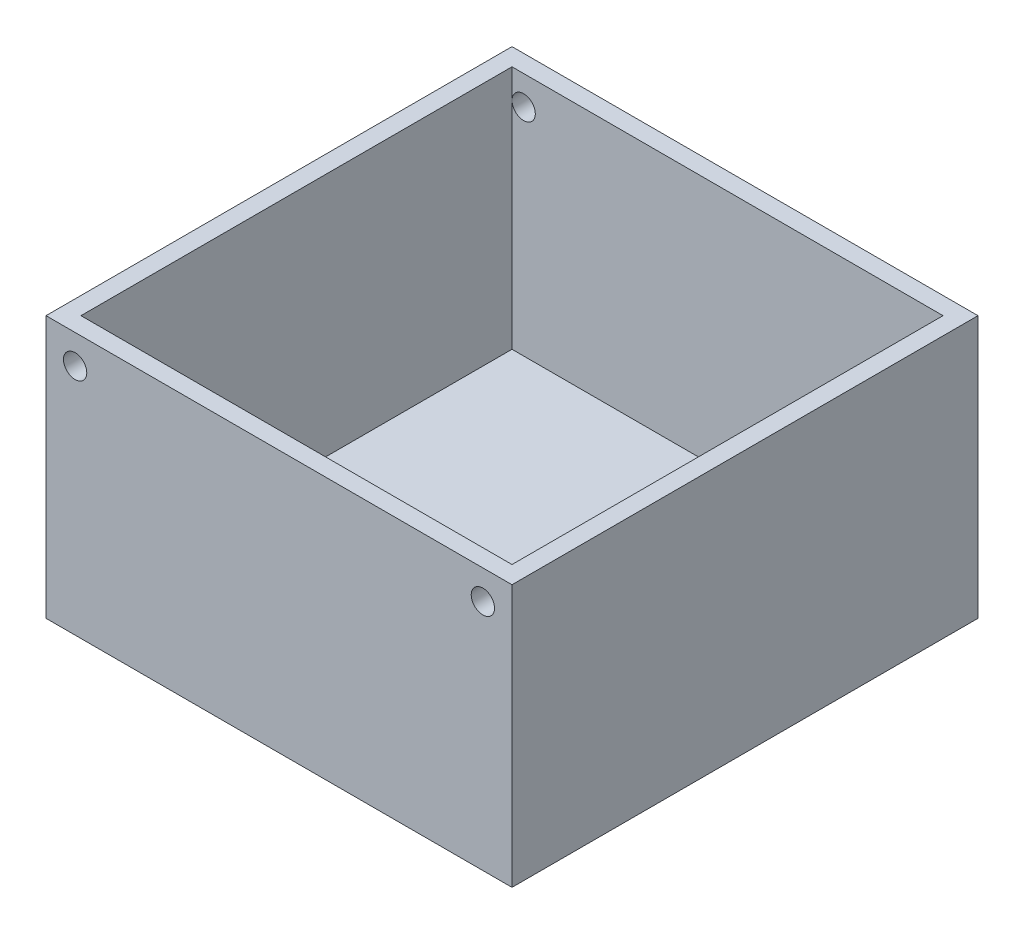
ISO-10303-21;
HEADER;
FILE_DESCRIPTION(('STEP AP214'),'2;1');
FILE_NAME('part.step','',(''),(''),'','','');
FILE_SCHEMA(('AUTOMOTIVE_DESIGN { 1 0 10303 214 1 1 1 1 }'));
ENDSEC;
DATA;
#1=APPLICATION_CONTEXT('core data for automotive mechanical design processes');
#2=APPLICATION_PROTOCOL_DEFINITION('international standard','automotive_design',2000,#1);
#3=PRODUCT_CONTEXT('',#1,'mechanical');
#4=PRODUCT('Part','Part','',(#3));
#5=PRODUCT_RELATED_PRODUCT_CATEGORY('part','',(#4));
#6=PRODUCT_DEFINITION_FORMATION('','',#4);
#7=PRODUCT_DEFINITION_CONTEXT('part definition',#1,'design');
#8=PRODUCT_DEFINITION('design','',#6,#7);
#9=PRODUCT_DEFINITION_SHAPE('','',#8);
#10=(LENGTH_UNIT() NAMED_UNIT(*) SI_UNIT(.MILLI.,.METRE.));
#11=(NAMED_UNIT(*) PLANE_ANGLE_UNIT() SI_UNIT($,.RADIAN.));
#12=(NAMED_UNIT(*) SI_UNIT($,.STERADIAN.) SOLID_ANGLE_UNIT());
#13=UNCERTAINTY_MEASURE_WITH_UNIT(LENGTH_MEASURE(1.E-05),#10,'distance_accuracy_value','');
#14=(GEOMETRIC_REPRESENTATION_CONTEXT(3) GLOBAL_UNCERTAINTY_ASSIGNED_CONTEXT((#13)) GLOBAL_UNIT_ASSIGNED_CONTEXT((#10,
#11,#12)) REPRESENTATION_CONTEXT('',''));
#15=CARTESIAN_POINT('',(0.,0.,0.));
#16=DIRECTION('',(0.,0.,1.));
#17=DIRECTION('',(1.,0.,0.));
#18=AXIS2_PLACEMENT_3D('',#15,#16,#17);
#19=CARTESIAN_POINT('',(0.,45.,80.));
#20=DIRECTION('',(0.,1.,0.));
#21=DIRECTION('',(-1.,0.,0.));
#22=AXIS2_PLACEMENT_3D('',#19,#20,#21);
#23=PLANE('',#22);
#24=DIRECTION('',(1.,0.,0.));
#25=VECTOR('',#24,1.);
#26=CARTESIAN_POINT('',(0.,45.,0.));
#27=LINE('',#26,#25);
#28=CARTESIAN_POINT('',(-40.,45.,0.));
#29=VERTEX_POINT('',#28);
#30=CARTESIAN_POINT('',(40.,45.,0.));
#31=VERTEX_POINT('',#30);
#32=EDGE_CURVE('E184',#29,#31,#27,.T.);
#33=ORIENTED_EDGE('',*,*,#32,.F.);
#34=DIRECTION('',(0.,0.,-1.));
#35=VECTOR('',#34,1.);
#36=CARTESIAN_POINT('',(-40.,45.,80.));
#37=LINE('',#36,#35);
#38=CARTESIAN_POINT('',(-40.,45.,80.));
#39=VERTEX_POINT('',#38);
#40=EDGE_CURVE('E48',#39,#29,#37,.T.);
#41=ORIENTED_EDGE('',*,*,#40,.F.);
#42=DIRECTION('',(1.,0.,0.));
#43=VECTOR('',#42,1.);
#44=CARTESIAN_POINT('',(0.,45.,80.));
#45=LINE('',#44,#43);
#46=CARTESIAN_POINT('',(40.,45.,80.));
#47=VERTEX_POINT('',#46);
#48=EDGE_CURVE('E172',#39,#47,#45,.T.);
#49=ORIENTED_EDGE('',*,*,#48,.T.);
#50=DIRECTION('',(0.,0.,-1.));
#51=VECTOR('',#50,1.);
#52=CARTESIAN_POINT('',(40.,45.,80.));
#53=LINE('',#52,#51);
#54=EDGE_CURVE('E11',#47,#31,#53,.T.);
#55=ORIENTED_EDGE('',*,*,#54,.T.);
#56=EDGE_LOOP('',(#33,#41,#49,#55));
#57=FACE_BOUND('',#56,.T.);
#58=DIRECTION('',(0.,0.,-1.));
#59=VECTOR('',#58,1.);
#60=CARTESIAN_POINT('',(-37.,45.,80.));
#61=LINE('',#60,#59);
#62=CARTESIAN_POINT('',(-37.,45.,77.));
#63=VERTEX_POINT('',#62);
#64=CARTESIAN_POINT('',(-37.,45.,3.));
#65=VERTEX_POINT('',#64);
#66=EDGE_CURVE('E158',#63,#65,#61,.T.);
#67=ORIENTED_EDGE('',*,*,#66,.T.);
#68=DIRECTION('',(1.,0.,0.));
#69=VECTOR('',#68,1.);
#70=CARTESIAN_POINT('',(0.,45.,3.));
#71=LINE('',#70,#69);
#72=CARTESIAN_POINT('',(37.,45.,3.));
#73=VERTEX_POINT('',#72);
#74=EDGE_CURVE('E143',#65,#73,#71,.T.);
#75=ORIENTED_EDGE('',*,*,#74,.T.);
#76=DIRECTION('',(0.,0.,-1.));
#77=VECTOR('',#76,1.);
#78=CARTESIAN_POINT('',(37.,45.,80.));
#79=LINE('',#78,#77);
#80=CARTESIAN_POINT('',(37.,45.,77.));
#81=VERTEX_POINT('',#80);
#82=EDGE_CURVE('E163',#81,#73,#79,.T.);
#83=ORIENTED_EDGE('',*,*,#82,.F.);
#84=DIRECTION('',(1.,0.,0.));
#85=VECTOR('',#84,1.);
#86=CARTESIAN_POINT('',(0.,45.,77.));
#87=LINE('',#86,#85);
#88=EDGE_CURVE('E153',#63,#81,#87,.T.);
#89=ORIENTED_EDGE('',*,*,#88,.F.);
#90=EDGE_LOOP('',(#67,#75,#83,#89));
#91=FACE_BOUND('',#90,.T.);
#92=ADVANCED_FACE('F39',(#57,#91),#23,.T.);
#93=CARTESIAN_POINT('',(40.,0.,80.));
#94=DIRECTION('',(-1.,0.,0.));
#95=DIRECTION('',(0.,-1.,0.));
#96=AXIS2_PLACEMENT_3D('',#93,#94,#95);
#97=PLANE('',#96);
#98=DIRECTION('',(0.,1.,0.));
#99=VECTOR('',#98,1.);
#100=CARTESIAN_POINT('',(40.,0.,0.));
#101=LINE('',#100,#99);
#102=CARTESIAN_POINT('',(40.,0.,0.));
#103=VERTEX_POINT('',#102);
#104=EDGE_CURVE('E164',#103,#31,#101,.T.);
#105=ORIENTED_EDGE('',*,*,#104,.T.);
#106=ORIENTED_EDGE('',*,*,#54,.F.);
#107=DIRECTION('',(0.,1.,0.));
#108=VECTOR('',#107,1.);
#109=CARTESIAN_POINT('',(40.,0.,80.));
#110=LINE('',#109,#108);
#111=CARTESIAN_POINT('',(40.,0.,80.));
#112=VERTEX_POINT('',#111);
#113=EDGE_CURVE('E170',#112,#47,#110,.T.);
#114=ORIENTED_EDGE('',*,*,#113,.F.);
#115=DIRECTION('',(0.,0.,-1.));
#116=VECTOR('',#115,1.);
#117=CARTESIAN_POINT('',(40.,0.,80.));
#118=LINE('',#117,#116);
#119=EDGE_CURVE('E181',#112,#103,#118,.T.);
#120=ORIENTED_EDGE('',*,*,#119,.T.);
#121=EDGE_LOOP('',(#105,#106,#114,#120));
#122=FACE_BOUND('',#121,.T.);
#123=ADVANCED_FACE('F41',(#122),#97,.F.);
#124=CARTESIAN_POINT('',(-40.,0.,80.));
#125=DIRECTION('',(-1.,0.,0.));
#126=DIRECTION('',(0.,0.,1.));
#127=AXIS2_PLACEMENT_3D('',#124,#125,#126);
#128=PLANE('',#127);
#129=DIRECTION('',(0.,1.,0.));
#130=VECTOR('',#129,1.);
#131=CARTESIAN_POINT('',(-40.,0.,0.));
#132=LINE('',#131,#130);
#133=CARTESIAN_POINT('',(-40.,0.,0.));
#134=VERTEX_POINT('',#133);
#135=EDGE_CURVE('E187',#134,#29,#132,.T.);
#136=ORIENTED_EDGE('',*,*,#135,.F.);
#137=DIRECTION('',(0.,0.,-1.));
#138=VECTOR('',#137,1.);
#139=CARTESIAN_POINT('',(-40.,0.,80.));
#140=LINE('',#139,#138);
#141=CARTESIAN_POINT('',(-40.,0.,80.));
#142=VERTEX_POINT('',#141);
#143=EDGE_CURVE('E193',#142,#134,#140,.T.);
#144=ORIENTED_EDGE('',*,*,#143,.F.);
#145=DIRECTION('',(0.,1.,0.));
#146=VECTOR('',#145,1.);
#147=CARTESIAN_POINT('',(-40.,0.,80.));
#148=LINE('',#147,#146);
#149=EDGE_CURVE('E176',#142,#39,#148,.T.);
#150=ORIENTED_EDGE('',*,*,#149,.T.);
#151=ORIENTED_EDGE('',*,*,#40,.T.);
#152=EDGE_LOOP('',(#136,#144,#150,#151));
#153=FACE_BOUND('',#152,.T.);
#154=ADVANCED_FACE('F240',(#153),#128,.T.);
#155=CARTESIAN_POINT('',(0.,0.,80.));
#156=DIRECTION('',(0.,1.,0.));
#157=DIRECTION('',(-1.,0.,0.));
#158=AXIS2_PLACEMENT_3D('',#155,#156,#157);
#159=PLANE('',#158);
#160=DIRECTION('',(1.,0.,0.));
#161=VECTOR('',#160,1.);
#162=CARTESIAN_POINT('',(0.,0.,0.));
#163=LINE('',#162,#161);
#164=EDGE_CURVE('E173',#134,#103,#163,.T.);
#165=ORIENTED_EDGE('',*,*,#164,.T.);
#166=ORIENTED_EDGE('',*,*,#119,.F.);
#167=DIRECTION('',(1.,0.,0.));
#168=VECTOR('',#167,1.);
#169=CARTESIAN_POINT('',(0.,0.,80.));
#170=LINE('',#169,#168);
#171=EDGE_CURVE('E179',#142,#112,#170,.T.);
#172=ORIENTED_EDGE('',*,*,#171,.F.);
#173=ORIENTED_EDGE('',*,*,#143,.T.);
#174=EDGE_LOOP('',(#165,#166,#172,#173));
#175=FACE_BOUND('',#174,.T.);
#176=ADVANCED_FACE('F237',(#175),#159,.F.);
#177=CARTESIAN_POINT('',(0.,0.,80.));
#178=DIRECTION('',(0.,0.,1.));
#179=DIRECTION('',(1.,0.,0.));
#180=AXIS2_PLACEMENT_3D('',#177,#178,#179);
#181=PLANE('',#180);
#182=CARTESIAN_POINT('',(-35.,40.,80.));
#183=DIRECTION('',(0.,0.,1.));
#184=DIRECTION('',(1.,0.,0.));
#185=AXIS2_PLACEMENT_3D('',#182,#183,#184);
#186=CIRCLE('',#185,2.);
#187=CARTESIAN_POINT('',(-33.,40.,80.));
#188=VERTEX_POINT('',#187);
#189=EDGE_CURVE('E196',#188,#188,#186,.T.);
#190=ORIENTED_EDGE('',*,*,#189,.F.);
#191=EDGE_LOOP('',(#190));
#192=FACE_BOUND('',#191,.T.);
#193=CARTESIAN_POINT('',(35.,40.,80.));
#194=DIRECTION('',(0.,0.,1.));
#195=DIRECTION('',(1.,0.,0.));
#196=AXIS2_PLACEMENT_3D('',#193,#194,#195);
#197=CIRCLE('',#196,2.);
#198=CARTESIAN_POINT('',(37.,40.,80.));
#199=VERTEX_POINT('',#198);
#200=EDGE_CURVE('E200',#199,#199,#197,.T.);
#201=ORIENTED_EDGE('',*,*,#200,.F.);
#202=EDGE_LOOP('',(#201));
#203=FACE_BOUND('',#202,.T.);
#204=ORIENTED_EDGE('',*,*,#113,.T.);
#205=ORIENTED_EDGE('',*,*,#48,.F.);
#206=ORIENTED_EDGE('',*,*,#149,.F.);
#207=ORIENTED_EDGE('',*,*,#171,.T.);
#208=EDGE_LOOP('',(#204,#205,#206,#207));
#209=FACE_BOUND('',#208,.T.);
#210=ADVANCED_FACE('F223',(#192,#203,#209),#181,.T.);
#211=CARTESIAN_POINT('',(0.,0.,0.));
#212=DIRECTION('',(0.,0.,1.));
#213=DIRECTION('',(1.,0.,0.));
#214=AXIS2_PLACEMENT_3D('',#211,#212,#213);
#215=PLANE('',#214);
#216=CARTESIAN_POINT('',(-35.,40.,0.));
#217=DIRECTION('',(0.,0.,1.));
#218=DIRECTION('',(1.,0.,0.));
#219=AXIS2_PLACEMENT_3D('',#216,#217,#218);
#220=CIRCLE('',#219,2.);
#221=CARTESIAN_POINT('',(-33.,40.,0.));
#222=VERTEX_POINT('',#221);
#223=EDGE_CURVE('E148',#222,#222,#220,.F.);
#224=ORIENTED_EDGE('',*,*,#223,.F.);
#225=EDGE_LOOP('',(#224));
#226=FACE_BOUND('',#225,.T.);
#227=CARTESIAN_POINT('',(35.,40.,0.));
#228=DIRECTION('',(0.,0.,1.));
#229=DIRECTION('',(1.,0.,0.));
#230=AXIS2_PLACEMENT_3D('',#227,#228,#229);
#231=CIRCLE('',#230,2.);
#232=CARTESIAN_POINT('',(37.,40.,0.));
#233=VERTEX_POINT('',#232);
#234=EDGE_CURVE('E197',#233,#233,#231,.F.);
#235=ORIENTED_EDGE('',*,*,#234,.F.);
#236=EDGE_LOOP('',(#235));
#237=FACE_BOUND('',#236,.T.);
#238=ORIENTED_EDGE('',*,*,#104,.F.);
#239=ORIENTED_EDGE('',*,*,#164,.F.);
#240=ORIENTED_EDGE('',*,*,#135,.T.);
#241=ORIENTED_EDGE('',*,*,#32,.T.);
#242=EDGE_LOOP('',(#238,#239,#240,#241));
#243=FACE_BOUND('',#242,.T.);
#244=ADVANCED_FACE('F220',(#226,#237,#243),#215,.F.);
#245=CARTESIAN_POINT('',(37.,0.,80.));
#246=DIRECTION('',(-1.,0.,0.));
#247=DIRECTION('',(0.,-1.,0.));
#248=AXIS2_PLACEMENT_3D('',#245,#246,#247);
#249=PLANE('',#248);
#250=DIRECTION('',(0.,1.,0.));
#251=VECTOR('',#250,1.);
#252=CARTESIAN_POINT('',(37.,0.,77.));
#253=LINE('',#252,#251);
#254=CARTESIAN_POINT('',(37.,3.00000000000001,77.));
#255=VERTEX_POINT('',#254);
#256=CARTESIAN_POINT('',(37.,40.,77.));
#257=VERTEX_POINT('',#256);
#258=EDGE_CURVE('E152',#255,#257,#253,.T.);
#259=ORIENTED_EDGE('',*,*,#258,.T.);
#260=EDGE_CURVE('E127',#257,#81,#253,.T.);
#261=ORIENTED_EDGE('',*,*,#260,.T.);
#262=ORIENTED_EDGE('',*,*,#82,.T.);
#263=DIRECTION('',(0.,1.,0.));
#264=VECTOR('',#263,1.);
#265=CARTESIAN_POINT('',(37.,0.,3.));
#266=LINE('',#265,#264);
#267=CARTESIAN_POINT('',(37.,40.,3.));
#268=VERTEX_POINT('',#267);
#269=EDGE_CURVE('E142',#268,#73,#266,.T.);
#270=ORIENTED_EDGE('',*,*,#269,.F.);
#271=CARTESIAN_POINT('',(37.,3.00000000000001,3.));
#272=VERTEX_POINT('',#271);
#273=EDGE_CURVE('E122',#272,#268,#266,.T.);
#274=ORIENTED_EDGE('',*,*,#273,.F.);
#275=DIRECTION('',(0.,0.,-1.));
#276=VECTOR('',#275,1.);
#277=CARTESIAN_POINT('',(37.,3.00000000000001,80.));
#278=LINE('',#277,#276);
#279=EDGE_CURVE('E130',#255,#272,#278,.T.);
#280=ORIENTED_EDGE('',*,*,#279,.F.);
#281=EDGE_LOOP('',(#259,#261,#262,#270,#274,#280));
#282=FACE_BOUND('',#281,.T.);
#283=ADVANCED_FACE('F140',(#282),#249,.T.);
#284=CARTESIAN_POINT('',(-37.,0.,80.));
#285=DIRECTION('',(-1.,0.,0.));
#286=DIRECTION('',(0.,0.,1.));
#287=AXIS2_PLACEMENT_3D('',#284,#285,#286);
#288=PLANE('',#287);
#289=DIRECTION('',(0.,1.,0.));
#290=VECTOR('',#289,1.);
#291=CARTESIAN_POINT('',(-37.,0.,3.));
#292=LINE('',#291,#290);
#293=CARTESIAN_POINT('',(-37.,2.99999999999999,3.));
#294=VERTEX_POINT('',#293);
#295=CARTESIAN_POINT('',(-37.,40.,3.));
#296=VERTEX_POINT('',#295);
#297=EDGE_CURVE('E125',#294,#296,#292,.T.);
#298=ORIENTED_EDGE('',*,*,#297,.T.);
#299=EDGE_CURVE('E146',#296,#65,#292,.T.);
#300=ORIENTED_EDGE('',*,*,#299,.T.);
#301=ORIENTED_EDGE('',*,*,#66,.F.);
#302=DIRECTION('',(0.,1.,0.));
#303=VECTOR('',#302,1.);
#304=CARTESIAN_POINT('',(-37.,0.,77.));
#305=LINE('',#304,#303);
#306=CARTESIAN_POINT('',(-37.,40.,77.));
#307=VERTEX_POINT('',#306);
#308=EDGE_CURVE('E162',#307,#63,#305,.T.);
#309=ORIENTED_EDGE('',*,*,#308,.F.);
#310=CARTESIAN_POINT('',(-37.,2.99999999999999,77.));
#311=VERTEX_POINT('',#310);
#312=EDGE_CURVE('E156',#311,#307,#305,.T.);
#313=ORIENTED_EDGE('',*,*,#312,.F.);
#314=DIRECTION('',(0.,0.,-1.));
#315=VECTOR('',#314,1.);
#316=CARTESIAN_POINT('',(-37.,2.99999999999999,80.));
#317=LINE('',#316,#315);
#318=EDGE_CURVE('E137',#311,#294,#317,.T.);
#319=ORIENTED_EDGE('',*,*,#318,.T.);
#320=EDGE_LOOP('',(#298,#300,#301,#309,#313,#319));
#321=FACE_BOUND('',#320,.T.);
#322=ADVANCED_FACE('F284',(#321),#288,.F.);
#323=CARTESIAN_POINT('',(0.,3.,80.));
#324=DIRECTION('',(0.,1.,0.));
#325=DIRECTION('',(-1.,0.,0.));
#326=AXIS2_PLACEMENT_3D('',#323,#324,#325);
#327=PLANE('',#326);
#328=DIRECTION('',(1.,0.,0.));
#329=VECTOR('',#328,1.);
#330=CARTESIAN_POINT('',(0.,3.,3.));
#331=LINE('',#330,#329);
#332=EDGE_CURVE('E116',#294,#272,#331,.T.);
#333=ORIENTED_EDGE('',*,*,#332,.F.);
#334=ORIENTED_EDGE('',*,*,#318,.F.);
#335=DIRECTION('',(1.,0.,0.));
#336=VECTOR('',#335,1.);
#337=CARTESIAN_POINT('',(0.,3.,77.));
#338=LINE('',#337,#336);
#339=EDGE_CURVE('E133',#311,#255,#338,.T.);
#340=ORIENTED_EDGE('',*,*,#339,.T.);
#341=ORIENTED_EDGE('',*,*,#279,.T.);
#342=EDGE_LOOP('',(#333,#334,#340,#341));
#343=FACE_BOUND('',#342,.T.);
#344=ADVANCED_FACE('F131',(#343),#327,.T.);
#345=CARTESIAN_POINT('',(0.,0.,77.));
#346=DIRECTION('',(0.,0.,1.));
#347=DIRECTION('',(1.,0.,0.));
#348=AXIS2_PLACEMENT_3D('',#345,#346,#347);
#349=PLANE('',#348);
#350=ORIENTED_EDGE('',*,*,#312,.T.);
#351=CARTESIAN_POINT('',(-35.,40.,77.));
#352=DIRECTION('',(0.,0.,1.));
#353=DIRECTION('',(1.,0.,0.));
#354=AXIS2_PLACEMENT_3D('',#351,#352,#353);
#355=CIRCLE('',#354,2.);
#356=EDGE_CURVE('E54',#307,#307,#355,.F.);
#357=ORIENTED_EDGE('',*,*,#356,.F.);
#358=ORIENTED_EDGE('',*,*,#308,.T.);
#359=ORIENTED_EDGE('',*,*,#88,.T.);
#360=ORIENTED_EDGE('',*,*,#260,.F.);
#361=CARTESIAN_POINT('',(35.,40.,77.));
#362=DIRECTION('',(0.,0.,1.));
#363=DIRECTION('',(1.,0.,0.));
#364=AXIS2_PLACEMENT_3D('',#361,#362,#363);
#365=CIRCLE('',#364,2.);
#366=EDGE_CURVE('E59',#257,#257,#365,.F.);
#367=ORIENTED_EDGE('',*,*,#366,.F.);
#368=ORIENTED_EDGE('',*,*,#258,.F.);
#369=ORIENTED_EDGE('',*,*,#339,.F.);
#370=EDGE_LOOP('',(#350,#357,#358,#359,#360,#367,#368,#369));
#371=FACE_BOUND('',#370,.T.);
#372=ADVANCED_FACE('F283',(#371),#349,.F.);
#373=CARTESIAN_POINT('',(0.,0.,3.));
#374=DIRECTION('',(0.,0.,1.));
#375=DIRECTION('',(1.,0.,0.));
#376=AXIS2_PLACEMENT_3D('',#373,#374,#375);
#377=PLANE('',#376);
#378=ORIENTED_EDGE('',*,*,#299,.F.);
#379=CARTESIAN_POINT('',(-35.,40.,3.));
#380=DIRECTION('',(0.,0.,1.));
#381=DIRECTION('',(1.,0.,0.));
#382=AXIS2_PLACEMENT_3D('',#379,#380,#381);
#383=CIRCLE('',#382,2.);
#384=EDGE_CURVE('E43',#296,#296,#383,.F.);
#385=ORIENTED_EDGE('',*,*,#384,.T.);
#386=ORIENTED_EDGE('',*,*,#297,.F.);
#387=ORIENTED_EDGE('',*,*,#332,.T.);
#388=ORIENTED_EDGE('',*,*,#273,.T.);
#389=CARTESIAN_POINT('',(35.,40.,3.));
#390=DIRECTION('',(0.,0.,1.));
#391=DIRECTION('',(1.,0.,0.));
#392=AXIS2_PLACEMENT_3D('',#389,#390,#391);
#393=CIRCLE('',#392,2.);
#394=EDGE_CURVE('E195',#268,#268,#393,.F.);
#395=ORIENTED_EDGE('',*,*,#394,.T.);
#396=ORIENTED_EDGE('',*,*,#269,.T.);
#397=ORIENTED_EDGE('',*,*,#74,.F.);
#398=EDGE_LOOP('',(#378,#385,#386,#387,#388,#395,#396,#397));
#399=FACE_BOUND('',#398,.T.);
#400=ADVANCED_FACE('F119',(#399),#377,.T.);
#401=CARTESIAN_POINT('',(35.,40.,80.));
#402=DIRECTION('',(0.,0.,-1.));
#403=DIRECTION('',(-1.,0.,0.));
#404=AXIS2_PLACEMENT_3D('',#401,#402,#403);
#405=CYLINDRICAL_SURFACE('',#404,2.);
#406=ORIENTED_EDGE('',*,*,#394,.F.);
#407=EDGE_LOOP('',(#406));
#408=FACE_BOUND('',#407,.T.);
#409=ORIENTED_EDGE('',*,*,#234,.T.);
#410=EDGE_LOOP('',(#409));
#411=FACE_BOUND('',#410,.T.);
#412=ADVANCED_FACE('F215',(#408,#411),#405,.F.);
#413=CARTESIAN_POINT('',(-35.,40.,80.));
#414=DIRECTION('',(0.,0.,-1.));
#415=DIRECTION('',(-1.,0.,0.));
#416=AXIS2_PLACEMENT_3D('',#413,#414,#415);
#417=CYLINDRICAL_SURFACE('',#416,2.);
#418=ORIENTED_EDGE('',*,*,#384,.F.);
#419=EDGE_LOOP('',(#418));
#420=FACE_BOUND('',#419,.T.);
#421=ORIENTED_EDGE('',*,*,#223,.T.);
#422=EDGE_LOOP('',(#421));
#423=FACE_BOUND('',#422,.T.);
#424=ADVANCED_FACE('F211',(#420,#423),#417,.F.);
#425=ORIENTED_EDGE('',*,*,#200,.T.);
#426=EDGE_LOOP('',(#425));
#427=FACE_BOUND('',#426,.T.);
#428=ORIENTED_EDGE('',*,*,#366,.T.);
#429=EDGE_LOOP('',(#428));
#430=FACE_BOUND('',#429,.T.);
#431=ADVANCED_FACE('F214',(#427,#430),#405,.F.);
#432=ORIENTED_EDGE('',*,*,#189,.T.);
#433=EDGE_LOOP('',(#432));
#434=FACE_BOUND('',#433,.T.);
#435=ORIENTED_EDGE('',*,*,#356,.T.);
#436=EDGE_LOOP('',(#435));
#437=FACE_BOUND('',#436,.T.);
#438=ADVANCED_FACE('F217',(#434,#437),#417,.F.);
#439=CLOSED_SHELL('',(#92,#123,#154,#176,#210,#244,#283,#322,#344,#372,#400,#412,#424,#431,#438));
#440=MANIFOLD_SOLID_BREP('B2',#439);
#441=ADVANCED_BREP_SHAPE_REPRESENTATION('',(#18,#440),#14);
#442=SHAPE_DEFINITION_REPRESENTATION(#9,#441);
ENDSEC;
END-ISO-10303-21;
